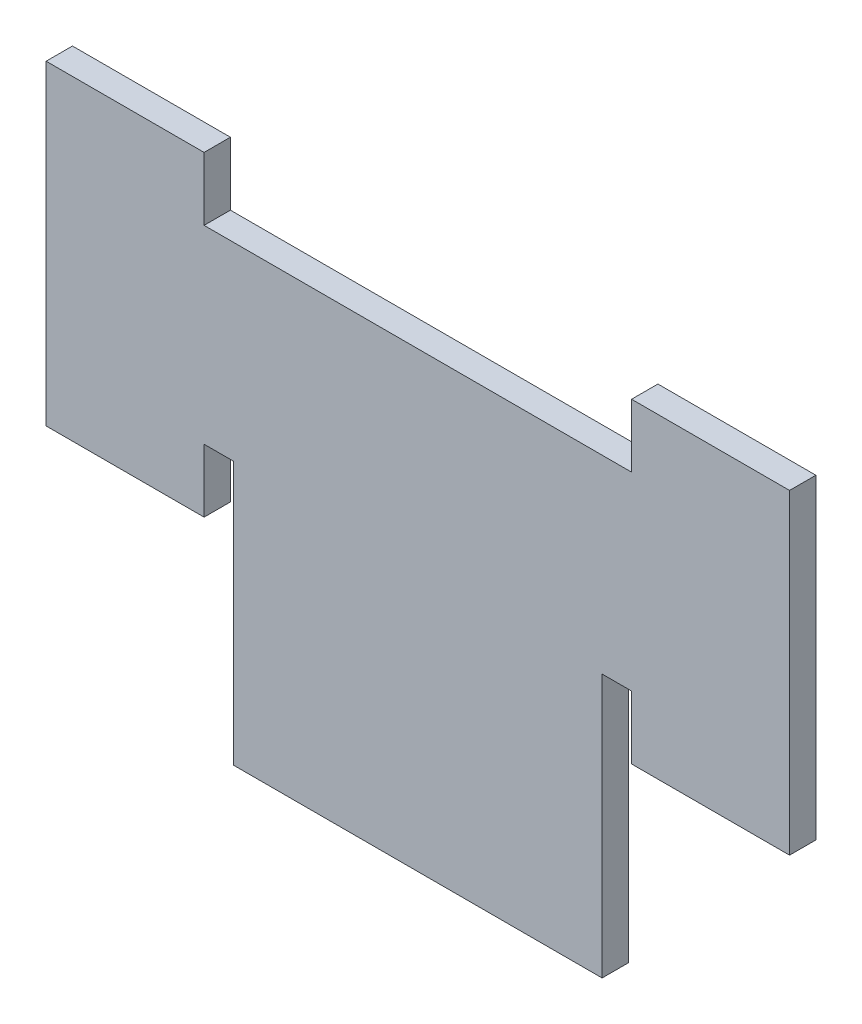
ISO-10303-21;
HEADER;
FILE_DESCRIPTION(('STEP AP214'),'2;1');
FILE_NAME('part.step','',(''),(''),'','','');
FILE_SCHEMA(('AUTOMOTIVE_DESIGN { 1 0 10303 214 1 1 1 1 }'));
ENDSEC;
DATA;
#1=APPLICATION_CONTEXT('core data for automotive mechanical design processes');
#2=APPLICATION_PROTOCOL_DEFINITION('international standard','automotive_design',2000,#1);
#3=PRODUCT_CONTEXT('',#1,'mechanical');
#4=PRODUCT('Part','Part','',(#3));
#5=PRODUCT_RELATED_PRODUCT_CATEGORY('part','',(#4));
#6=PRODUCT_DEFINITION_FORMATION('','',#4);
#7=PRODUCT_DEFINITION_CONTEXT('part definition',#1,'design');
#8=PRODUCT_DEFINITION('design','',#6,#7);
#9=PRODUCT_DEFINITION_SHAPE('','',#8);
#10=(LENGTH_UNIT() NAMED_UNIT(*) SI_UNIT(.MILLI.,.METRE.));
#11=(NAMED_UNIT(*) PLANE_ANGLE_UNIT() SI_UNIT($,.RADIAN.));
#12=(NAMED_UNIT(*) SI_UNIT($,.STERADIAN.) SOLID_ANGLE_UNIT());
#13=UNCERTAINTY_MEASURE_WITH_UNIT(LENGTH_MEASURE(1.E-05),#10,'distance_accuracy_value','');
#14=(GEOMETRIC_REPRESENTATION_CONTEXT(3) GLOBAL_UNCERTAINTY_ASSIGNED_CONTEXT((#13)) GLOBAL_UNIT_ASSIGNED_CONTEXT((#10,
#11,#12)) REPRESENTATION_CONTEXT('',''));
#15=CARTESIAN_POINT('',(0.,0.,0.));
#16=DIRECTION('',(0.,0.,1.));
#17=DIRECTION('',(1.,0.,0.));
#18=AXIS2_PLACEMENT_3D('',#15,#16,#17);
#19=CARTESIAN_POINT('',(44.45,31.75,3.175));
#20=DIRECTION('',(-1.,0.,0.));
#21=DIRECTION('',(0.,-1.,0.));
#22=AXIS2_PLACEMENT_3D('',#19,#20,#21);
#23=PLANE('',#22);
#24=DIRECTION('',(0.,1.,0.));
#25=VECTOR('',#24,1.);
#26=CARTESIAN_POINT('',(44.45,31.75,0.));
#27=LINE('',#26,#25);
#28=CARTESIAN_POINT('',(44.45,0.,0.));
#29=VERTEX_POINT('',#28);
#30=CARTESIAN_POINT('',(44.45,31.75,0.));
#31=VERTEX_POINT('',#30);
#32=EDGE_CURVE('E176',#29,#31,#27,.T.);
#33=ORIENTED_EDGE('',*,*,#32,.T.);
#34=DIRECTION('',(0.,0.,-1.));
#35=VECTOR('',#34,1.);
#36=CARTESIAN_POINT('',(44.45,31.75,3.175));
#37=LINE('',#36,#35);
#38=CARTESIAN_POINT('',(44.45,31.75,3.175));
#39=VERTEX_POINT('',#38);
#40=EDGE_CURVE('E11',#39,#31,#37,.T.);
#41=ORIENTED_EDGE('',*,*,#40,.F.);
#42=DIRECTION('',(0.,1.,0.));
#43=VECTOR('',#42,1.);
#44=CARTESIAN_POINT('',(44.45,31.75,3.175));
#45=LINE('',#44,#43);
#46=CARTESIAN_POINT('',(44.45,0.,3.175));
#47=VERTEX_POINT('',#46);
#48=EDGE_CURVE('E206',#47,#39,#45,.T.);
#49=ORIENTED_EDGE('',*,*,#48,.F.);
#50=DIRECTION('',(0.,0.,-1.));
#51=VECTOR('',#50,1.);
#52=CARTESIAN_POINT('',(44.45,0.,3.175));
#53=LINE('',#52,#51);
#54=EDGE_CURVE('E172',#47,#29,#53,.T.);
#55=ORIENTED_EDGE('',*,*,#54,.T.);
#56=EDGE_LOOP('',(#33,#41,#49,#55));
#57=FACE_BOUND('',#56,.T.);
#58=ADVANCED_FACE('F32',(#57),#23,.F.);
#59=CARTESIAN_POINT('',(44.45,31.75,3.175));
#60=DIRECTION('',(0.,1.,0.));
#61=DIRECTION('',(-1.,0.,0.));
#62=AXIS2_PLACEMENT_3D('',#59,#60,#61);
#63=PLANE('',#62);
#64=DIRECTION('',(1.,0.,0.));
#65=VECTOR('',#64,1.);
#66=CARTESIAN_POINT('',(44.45,31.75,0.));
#67=LINE('',#66,#65);
#68=CARTESIAN_POINT('',(48.006,31.75,0.));
#69=VERTEX_POINT('',#68);
#70=EDGE_CURVE('E179',#31,#69,#67,.T.);
#71=ORIENTED_EDGE('',*,*,#70,.T.);
#72=DIRECTION('',(0.,0.,-1.));
#73=VECTOR('',#72,1.);
#74=CARTESIAN_POINT('',(48.006,31.75,3.175));
#75=LINE('',#74,#73);
#76=CARTESIAN_POINT('',(48.006,31.75,3.175));
#77=VERTEX_POINT('',#76);
#78=EDGE_CURVE('E40',#77,#69,#75,.T.);
#79=ORIENTED_EDGE('',*,*,#78,.F.);
#80=DIRECTION('',(1.,0.,0.));
#81=VECTOR('',#80,1.);
#82=CARTESIAN_POINT('',(44.45,31.75,3.175));
#83=LINE('',#82,#81);
#84=EDGE_CURVE('E115',#39,#77,#83,.T.);
#85=ORIENTED_EDGE('',*,*,#84,.F.);
#86=ORIENTED_EDGE('',*,*,#40,.T.);
#87=EDGE_LOOP('',(#71,#79,#85,#86));
#88=FACE_BOUND('',#87,.T.);
#89=ADVANCED_FACE('F304',(#88),#63,.F.);
#90=CARTESIAN_POINT('',(48.006,31.75,3.175));
#91=DIRECTION('',(1.,0.,0.));
#92=DIRECTION('',(0.,1.,0.));
#93=AXIS2_PLACEMENT_3D('',#90,#91,#92);
#94=PLANE('',#93);
#95=DIRECTION('',(0.,-1.,0.));
#96=VECTOR('',#95,1.);
#97=CARTESIAN_POINT('',(48.006,31.75,0.));
#98=LINE('',#97,#96);
#99=CARTESIAN_POINT('',(48.006,24.13,0.));
#100=VERTEX_POINT('',#99);
#101=EDGE_CURVE('E181',#69,#100,#98,.T.);
#102=ORIENTED_EDGE('',*,*,#101,.T.);
#103=DIRECTION('',(0.,0.,-1.));
#104=VECTOR('',#103,1.);
#105=CARTESIAN_POINT('',(48.006,24.13,3.175));
#106=LINE('',#105,#104);
#107=CARTESIAN_POINT('',(48.006,24.13,3.175));
#108=VERTEX_POINT('',#107);
#109=EDGE_CURVE('E237',#108,#100,#106,.T.);
#110=ORIENTED_EDGE('',*,*,#109,.F.);
#111=DIRECTION('',(0.,-1.,0.));
#112=VECTOR('',#111,1.);
#113=CARTESIAN_POINT('',(48.006,31.75,3.175));
#114=LINE('',#113,#112);
#115=EDGE_CURVE('E245',#77,#108,#114,.T.);
#116=ORIENTED_EDGE('',*,*,#115,.F.);
#117=ORIENTED_EDGE('',*,*,#78,.T.);
#118=EDGE_LOOP('',(#102,#110,#116,#117));
#119=FACE_BOUND('',#118,.T.);
#120=ADVANCED_FACE('F243',(#119),#94,.F.);
#121=CARTESIAN_POINT('',(48.006,24.13,3.175));
#122=DIRECTION('',(0.,1.,0.));
#123=DIRECTION('',(-1.,0.,0.));
#124=AXIS2_PLACEMENT_3D('',#121,#122,#123);
#125=PLANE('',#124);
#126=DIRECTION('',(1.,0.,0.));
#127=VECTOR('',#126,1.);
#128=CARTESIAN_POINT('',(48.006,24.13,0.));
#129=LINE('',#128,#127);
#130=CARTESIAN_POINT('',(67.056,24.13,0.));
#131=VERTEX_POINT('',#130);
#132=EDGE_CURVE('E183',#100,#131,#129,.T.);
#133=ORIENTED_EDGE('',*,*,#132,.T.);
#134=DIRECTION('',(0.,0.,-1.));
#135=VECTOR('',#134,1.);
#136=CARTESIAN_POINT('',(67.056,24.13,3.175));
#137=LINE('',#136,#135);
#138=CARTESIAN_POINT('',(67.056,24.13,3.175));
#139=VERTEX_POINT('',#138);
#140=EDGE_CURVE('E234',#139,#131,#137,.T.);
#141=ORIENTED_EDGE('',*,*,#140,.F.);
#142=DIRECTION('',(1.,0.,0.));
#143=VECTOR('',#142,1.);
#144=CARTESIAN_POINT('',(48.006,24.13,3.175));
#145=LINE('',#144,#143);
#146=EDGE_CURVE('E263',#108,#139,#145,.T.);
#147=ORIENTED_EDGE('',*,*,#146,.F.);
#148=ORIENTED_EDGE('',*,*,#109,.T.);
#149=EDGE_LOOP('',(#133,#141,#147,#148));
#150=FACE_BOUND('',#149,.T.);
#151=ADVANCED_FACE('F254',(#150),#125,.F.);
#152=CARTESIAN_POINT('',(67.056,24.13,3.175));
#153=DIRECTION('',(-1.,0.,0.));
#154=DIRECTION('',(0.,0.,1.));
#155=AXIS2_PLACEMENT_3D('',#152,#153,#154);
#156=PLANE('',#155);
#157=DIRECTION('',(0.,1.,0.));
#158=VECTOR('',#157,1.);
#159=CARTESIAN_POINT('',(67.056,24.13,0.));
#160=LINE('',#159,#158);
#161=CARTESIAN_POINT('',(67.056,62.23,0.));
#162=VERTEX_POINT('',#161);
#163=EDGE_CURVE('E185',#131,#162,#160,.T.);
#164=ORIENTED_EDGE('',*,*,#163,.T.);
#165=DIRECTION('',(0.,0.,-1.));
#166=VECTOR('',#165,1.);
#167=CARTESIAN_POINT('',(67.056,62.23,3.175));
#168=LINE('',#167,#166);
#169=CARTESIAN_POINT('',(67.056,62.23,3.175));
#170=VERTEX_POINT('',#169);
#171=EDGE_CURVE('E231',#170,#162,#168,.T.);
#172=ORIENTED_EDGE('',*,*,#171,.F.);
#173=DIRECTION('',(0.,1.,0.));
#174=VECTOR('',#173,1.);
#175=CARTESIAN_POINT('',(67.056,24.13,3.175));
#176=LINE('',#175,#174);
#177=EDGE_CURVE('E260',#139,#170,#176,.T.);
#178=ORIENTED_EDGE('',*,*,#177,.F.);
#179=ORIENTED_EDGE('',*,*,#140,.T.);
#180=EDGE_LOOP('',(#164,#172,#178,#179));
#181=FACE_BOUND('',#180,.T.);
#182=ADVANCED_FACE('F258',(#181),#156,.F.);
#183=CARTESIAN_POINT('',(67.056,62.23,3.175));
#184=DIRECTION('',(0.,-1.,0.));
#185=DIRECTION('',(0.,0.,-1.));
#186=AXIS2_PLACEMENT_3D('',#183,#184,#185);
#187=PLANE('',#186);
#188=DIRECTION('',(-1.,0.,0.));
#189=VECTOR('',#188,1.);
#190=CARTESIAN_POINT('',(67.056,62.23,0.));
#191=LINE('',#190,#189);
#192=CARTESIAN_POINT('',(48.006,62.23,0.));
#193=VERTEX_POINT('',#192);
#194=EDGE_CURVE('E187',#162,#193,#191,.T.);
#195=ORIENTED_EDGE('',*,*,#194,.T.);
#196=DIRECTION('',(0.,0.,-1.));
#197=VECTOR('',#196,1.);
#198=CARTESIAN_POINT('',(48.006,62.23,3.175));
#199=LINE('',#198,#197);
#200=CARTESIAN_POINT('',(48.006,62.23,3.175));
#201=VERTEX_POINT('',#200);
#202=EDGE_CURVE('E228',#201,#193,#199,.T.);
#203=ORIENTED_EDGE('',*,*,#202,.F.);
#204=DIRECTION('',(-1.,0.,0.));
#205=VECTOR('',#204,1.);
#206=CARTESIAN_POINT('',(67.056,62.23,3.175));
#207=LINE('',#206,#205);
#208=EDGE_CURVE('E262',#170,#201,#207,.T.);
#209=ORIENTED_EDGE('',*,*,#208,.F.);
#210=ORIENTED_EDGE('',*,*,#171,.T.);
#211=EDGE_LOOP('',(#195,#203,#209,#210));
#212=FACE_BOUND('',#211,.T.);
#213=ADVANCED_FACE('F317',(#212),#187,.F.);
#214=CARTESIAN_POINT('',(48.006,62.23,3.175));
#215=DIRECTION('',(1.,0.,0.));
#216=DIRECTION('',(0.,1.,0.));
#217=AXIS2_PLACEMENT_3D('',#214,#215,#216);
#218=PLANE('',#217);
#219=DIRECTION('',(0.,-1.,0.));
#220=VECTOR('',#219,1.);
#221=CARTESIAN_POINT('',(48.006,62.23,0.));
#222=LINE('',#221,#220);
#223=CARTESIAN_POINT('',(48.006,54.61,0.));
#224=VERTEX_POINT('',#223);
#225=EDGE_CURVE('E189',#193,#224,#222,.T.);
#226=ORIENTED_EDGE('',*,*,#225,.T.);
#227=DIRECTION('',(0.,0.,-1.));
#228=VECTOR('',#227,1.);
#229=CARTESIAN_POINT('',(48.006,54.61,3.175));
#230=LINE('',#229,#228);
#231=CARTESIAN_POINT('',(48.006,54.61,3.175));
#232=VERTEX_POINT('',#231);
#233=EDGE_CURVE('E225',#232,#224,#230,.T.);
#234=ORIENTED_EDGE('',*,*,#233,.F.);
#235=DIRECTION('',(0.,-1.,0.));
#236=VECTOR('',#235,1.);
#237=CARTESIAN_POINT('',(48.006,62.23,3.175));
#238=LINE('',#237,#236);
#239=EDGE_CURVE('E265',#201,#232,#238,.T.);
#240=ORIENTED_EDGE('',*,*,#239,.F.);
#241=ORIENTED_EDGE('',*,*,#202,.T.);
#242=EDGE_LOOP('',(#226,#234,#240,#241));
#243=FACE_BOUND('',#242,.T.);
#244=ADVANCED_FACE('F320',(#243),#218,.F.);
#245=CARTESIAN_POINT('',(-3.556,54.61,3.175));
#246=DIRECTION('',(0.,-1.,0.));
#247=DIRECTION('',(0.,0.,-1.));
#248=AXIS2_PLACEMENT_3D('',#245,#246,#247);
#249=PLANE('',#248);
#250=DIRECTION('',(-1.,0.,0.));
#251=VECTOR('',#250,1.);
#252=CARTESIAN_POINT('',(-3.556,54.61,0.));
#253=LINE('',#252,#251);
#254=CARTESIAN_POINT('',(-3.556,54.61,0.));
#255=VERTEX_POINT('',#254);
#256=EDGE_CURVE('E191',#224,#255,#253,.T.);
#257=ORIENTED_EDGE('',*,*,#256,.T.);
#258=DIRECTION('',(0.,0.,-1.));
#259=VECTOR('',#258,1.);
#260=CARTESIAN_POINT('',(-3.556,54.61,3.175));
#261=LINE('',#260,#259);
#262=CARTESIAN_POINT('',(-3.556,54.61,3.175));
#263=VERTEX_POINT('',#262);
#264=EDGE_CURVE('E222',#263,#255,#261,.T.);
#265=ORIENTED_EDGE('',*,*,#264,.F.);
#266=DIRECTION('',(-1.,0.,0.));
#267=VECTOR('',#266,1.);
#268=CARTESIAN_POINT('',(-3.556,54.61,3.175));
#269=LINE('',#268,#267);
#270=EDGE_CURVE('E271',#232,#263,#269,.T.);
#271=ORIENTED_EDGE('',*,*,#270,.F.);
#272=ORIENTED_EDGE('',*,*,#233,.T.);
#273=EDGE_LOOP('',(#257,#265,#271,#272));
#274=FACE_BOUND('',#273,.T.);
#275=ADVANCED_FACE('F324',(#274),#249,.F.);
#276=CARTESIAN_POINT('',(-3.556,62.23,3.175));
#277=DIRECTION('',(-1.,0.,0.));
#278=DIRECTION('',(0.,-1.,0.));
#279=AXIS2_PLACEMENT_3D('',#276,#277,#278);
#280=PLANE('',#279);
#281=DIRECTION('',(0.,1.,0.));
#282=VECTOR('',#281,1.);
#283=CARTESIAN_POINT('',(-3.556,62.23,0.));
#284=LINE('',#283,#282);
#285=CARTESIAN_POINT('',(-3.556,62.23,0.));
#286=VERTEX_POINT('',#285);
#287=EDGE_CURVE('E193',#255,#286,#284,.T.);
#288=ORIENTED_EDGE('',*,*,#287,.T.);
#289=DIRECTION('',(0.,0.,-1.));
#290=VECTOR('',#289,1.);
#291=CARTESIAN_POINT('',(-3.556,62.23,3.175));
#292=LINE('',#291,#290);
#293=CARTESIAN_POINT('',(-3.556,62.23,3.175));
#294=VERTEX_POINT('',#293);
#295=EDGE_CURVE('E219',#294,#286,#292,.T.);
#296=ORIENTED_EDGE('',*,*,#295,.F.);
#297=DIRECTION('',(0.,1.,0.));
#298=VECTOR('',#297,1.);
#299=CARTESIAN_POINT('',(-3.556,62.23,3.175));
#300=LINE('',#299,#298);
#301=EDGE_CURVE('E273',#263,#294,#300,.T.);
#302=ORIENTED_EDGE('',*,*,#301,.F.);
#303=ORIENTED_EDGE('',*,*,#264,.T.);
#304=EDGE_LOOP('',(#288,#296,#302,#303));
#305=FACE_BOUND('',#304,.T.);
#306=ADVANCED_FACE('F328',(#305),#280,.F.);
#307=CARTESIAN_POINT('',(-22.606,62.23,3.175));
#308=DIRECTION('',(0.,-1.,0.));
#309=DIRECTION('',(1.,0.,0.));
#310=AXIS2_PLACEMENT_3D('',#307,#308,#309);
#311=PLANE('',#310);
#312=DIRECTION('',(-1.,0.,0.));
#313=VECTOR('',#312,1.);
#314=CARTESIAN_POINT('',(-22.606,62.23,0.));
#315=LINE('',#314,#313);
#316=CARTESIAN_POINT('',(-22.606,62.23,0.));
#317=VERTEX_POINT('',#316);
#318=EDGE_CURVE('E195',#286,#317,#315,.T.);
#319=ORIENTED_EDGE('',*,*,#318,.T.);
#320=DIRECTION('',(0.,0.,-1.));
#321=VECTOR('',#320,1.);
#322=CARTESIAN_POINT('',(-22.606,62.23,3.175));
#323=LINE('',#322,#321);
#324=CARTESIAN_POINT('',(-22.606,62.23,3.175));
#325=VERTEX_POINT('',#324);
#326=EDGE_CURVE('E216',#325,#317,#323,.T.);
#327=ORIENTED_EDGE('',*,*,#326,.F.);
#328=DIRECTION('',(-1.,0.,0.));
#329=VECTOR('',#328,1.);
#330=CARTESIAN_POINT('',(-22.606,62.23,3.175));
#331=LINE('',#330,#329);
#332=EDGE_CURVE('E275',#294,#325,#331,.T.);
#333=ORIENTED_EDGE('',*,*,#332,.F.);
#334=ORIENTED_EDGE('',*,*,#295,.T.);
#335=EDGE_LOOP('',(#319,#327,#333,#334));
#336=FACE_BOUND('',#335,.T.);
#337=ADVANCED_FACE('F332',(#336),#311,.F.);
#338=CARTESIAN_POINT('',(-22.606,24.13,3.175));
#339=DIRECTION('',(1.,0.,0.));
#340=DIRECTION('',(0.,0.,-1.));
#341=AXIS2_PLACEMENT_3D('',#338,#339,#340);
#342=PLANE('',#341);
#343=DIRECTION('',(0.,-1.,0.));
#344=VECTOR('',#343,1.);
#345=CARTESIAN_POINT('',(-22.606,24.13,0.));
#346=LINE('',#345,#344);
#347=CARTESIAN_POINT('',(-22.606,24.13,0.));
#348=VERTEX_POINT('',#347);
#349=EDGE_CURVE('E197',#317,#348,#346,.T.);
#350=ORIENTED_EDGE('',*,*,#349,.T.);
#351=DIRECTION('',(0.,0.,-1.));
#352=VECTOR('',#351,1.);
#353=CARTESIAN_POINT('',(-22.606,24.13,3.175));
#354=LINE('',#353,#352);
#355=CARTESIAN_POINT('',(-22.606,24.13,3.175));
#356=VERTEX_POINT('',#355);
#357=EDGE_CURVE('E213',#356,#348,#354,.T.);
#358=ORIENTED_EDGE('',*,*,#357,.F.);
#359=DIRECTION('',(0.,-1.,0.));
#360=VECTOR('',#359,1.);
#361=CARTESIAN_POINT('',(-22.606,24.13,3.175));
#362=LINE('',#361,#360);
#363=EDGE_CURVE('E277',#325,#356,#362,.T.);
#364=ORIENTED_EDGE('',*,*,#363,.F.);
#365=ORIENTED_EDGE('',*,*,#326,.T.);
#366=EDGE_LOOP('',(#350,#358,#364,#365));
#367=FACE_BOUND('',#366,.T.);
#368=ADVANCED_FACE('F336',(#367),#342,.F.);
#369=CARTESIAN_POINT('',(-3.556,24.13,3.175));
#370=DIRECTION('',(0.,1.,0.));
#371=DIRECTION('',(0.,0.,1.));
#372=AXIS2_PLACEMENT_3D('',#369,#370,#371);
#373=PLANE('',#372);
#374=DIRECTION('',(1.,0.,0.));
#375=VECTOR('',#374,1.);
#376=CARTESIAN_POINT('',(-3.556,24.13,0.));
#377=LINE('',#376,#375);
#378=CARTESIAN_POINT('',(-3.556,24.13,0.));
#379=VERTEX_POINT('',#378);
#380=EDGE_CURVE('E199',#348,#379,#377,.T.);
#381=ORIENTED_EDGE('',*,*,#380,.T.);
#382=DIRECTION('',(0.,0.,-1.));
#383=VECTOR('',#382,1.);
#384=CARTESIAN_POINT('',(-3.556,24.13,3.175));
#385=LINE('',#384,#383);
#386=CARTESIAN_POINT('',(-3.556,24.13,3.175));
#387=VERTEX_POINT('',#386);
#388=EDGE_CURVE('E210',#387,#379,#385,.T.);
#389=ORIENTED_EDGE('',*,*,#388,.F.);
#390=DIRECTION('',(1.,0.,0.));
#391=VECTOR('',#390,1.);
#392=CARTESIAN_POINT('',(-3.556,24.13,3.175));
#393=LINE('',#392,#391);
#394=EDGE_CURVE('E279',#356,#387,#393,.T.);
#395=ORIENTED_EDGE('',*,*,#394,.F.);
#396=ORIENTED_EDGE('',*,*,#357,.T.);
#397=EDGE_LOOP('',(#381,#389,#395,#396));
#398=FACE_BOUND('',#397,.T.);
#399=ADVANCED_FACE('F285',(#398),#373,.F.);
#400=CARTESIAN_POINT('',(-3.556,31.75,3.175));
#401=DIRECTION('',(-1.,0.,0.));
#402=DIRECTION('',(0.,-1.,0.));
#403=AXIS2_PLACEMENT_3D('',#400,#401,#402);
#404=PLANE('',#403);
#405=DIRECTION('',(0.,1.,0.));
#406=VECTOR('',#405,1.);
#407=CARTESIAN_POINT('',(-3.556,31.75,0.));
#408=LINE('',#407,#406);
#409=CARTESIAN_POINT('',(-3.556,31.75,0.));
#410=VERTEX_POINT('',#409);
#411=EDGE_CURVE('E201',#379,#410,#408,.T.);
#412=ORIENTED_EDGE('',*,*,#411,.T.);
#413=DIRECTION('',(0.,0.,-1.));
#414=VECTOR('',#413,1.);
#415=CARTESIAN_POINT('',(-3.556,31.75,3.175));
#416=LINE('',#415,#414);
#417=CARTESIAN_POINT('',(-3.556,31.75,3.175));
#418=VERTEX_POINT('',#417);
#419=EDGE_CURVE('E167',#418,#410,#416,.T.);
#420=ORIENTED_EDGE('',*,*,#419,.F.);
#421=DIRECTION('',(0.,1.,0.));
#422=VECTOR('',#421,1.);
#423=CARTESIAN_POINT('',(-3.556,31.75,3.175));
#424=LINE('',#423,#422);
#425=EDGE_CURVE('E158',#387,#418,#424,.T.);
#426=ORIENTED_EDGE('',*,*,#425,.F.);
#427=ORIENTED_EDGE('',*,*,#388,.T.);
#428=EDGE_LOOP('',(#412,#420,#426,#427));
#429=FACE_BOUND('',#428,.T.);
#430=ADVANCED_FACE('F289',(#429),#404,.F.);
#431=CARTESIAN_POINT('',(0.,31.75,3.175));
#432=DIRECTION('',(0.,1.,0.));
#433=DIRECTION('',(0.,0.,1.));
#434=AXIS2_PLACEMENT_3D('',#431,#432,#433);
#435=PLANE('',#434);
#436=DIRECTION('',(1.,0.,0.));
#437=VECTOR('',#436,1.);
#438=CARTESIAN_POINT('',(0.,31.75,0.));
#439=LINE('',#438,#437);
#440=CARTESIAN_POINT('',(0.,31.75,0.));
#441=VERTEX_POINT('',#440);
#442=EDGE_CURVE('E166',#410,#441,#439,.T.);
#443=ORIENTED_EDGE('',*,*,#442,.T.);
#444=DIRECTION('',(0.,0.,-1.));
#445=VECTOR('',#444,1.);
#446=CARTESIAN_POINT('',(0.,31.75,3.175));
#447=LINE('',#446,#445);
#448=CARTESIAN_POINT('',(0.,31.75,3.175));
#449=VERTEX_POINT('',#448);
#450=EDGE_CURVE('E163',#449,#441,#447,.T.);
#451=ORIENTED_EDGE('',*,*,#450,.F.);
#452=DIRECTION('',(1.,0.,0.));
#453=VECTOR('',#452,1.);
#454=CARTESIAN_POINT('',(0.,31.75,3.175));
#455=LINE('',#454,#453);
#456=EDGE_CURVE('E152',#418,#449,#455,.T.);
#457=ORIENTED_EDGE('',*,*,#456,.F.);
#458=ORIENTED_EDGE('',*,*,#419,.T.);
#459=EDGE_LOOP('',(#443,#451,#457,#458));
#460=FACE_BOUND('',#459,.T.);
#461=ADVANCED_FACE('F164',(#460),#435,.F.);
#462=CARTESIAN_POINT('',(0.,31.75,3.175));
#463=DIRECTION('',(1.,0.,0.));
#464=DIRECTION('',(0.,1.,0.));
#465=AXIS2_PLACEMENT_3D('',#462,#463,#464);
#466=PLANE('',#465);
#467=DIRECTION('',(0.,-1.,0.));
#468=VECTOR('',#467,1.);
#469=CARTESIAN_POINT('',(0.,31.75,0.));
#470=LINE('',#469,#468);
#471=CARTESIAN_POINT('',(0.,0.,0.));
#472=VERTEX_POINT('',#471);
#473=EDGE_CURVE('E101',#441,#472,#470,.T.);
#474=ORIENTED_EDGE('',*,*,#473,.T.);
#475=DIRECTION('',(0.,0.,-1.));
#476=VECTOR('',#475,1.);
#477=CARTESIAN_POINT('',(0.,0.,3.175));
#478=LINE('',#477,#476);
#479=CARTESIAN_POINT('',(0.,0.,3.175));
#480=VERTEX_POINT('',#479);
#481=EDGE_CURVE('E168',#480,#472,#478,.T.);
#482=ORIENTED_EDGE('',*,*,#481,.F.);
#483=DIRECTION('',(0.,-1.,0.));
#484=VECTOR('',#483,1.);
#485=CARTESIAN_POINT('',(0.,31.75,3.175));
#486=LINE('',#485,#484);
#487=EDGE_CURVE('E156',#449,#480,#486,.T.);
#488=ORIENTED_EDGE('',*,*,#487,.F.);
#489=ORIENTED_EDGE('',*,*,#450,.T.);
#490=EDGE_LOOP('',(#474,#482,#488,#489));
#491=FACE_BOUND('',#490,.T.);
#492=ADVANCED_FACE('F170',(#491),#466,.F.);
#493=CARTESIAN_POINT('',(0.,0.,3.175));
#494=DIRECTION('',(0.,1.,0.));
#495=DIRECTION('',(0.,0.,1.));
#496=AXIS2_PLACEMENT_3D('',#493,#494,#495);
#497=PLANE('',#496);
#498=DIRECTION('',(1.,0.,0.));
#499=VECTOR('',#498,1.);
#500=CARTESIAN_POINT('',(0.,0.,0.));
#501=LINE('',#500,#499);
#502=EDGE_CURVE('E107',#472,#29,#501,.T.);
#503=ORIENTED_EDGE('',*,*,#502,.T.);
#504=ORIENTED_EDGE('',*,*,#54,.F.);
#505=DIRECTION('',(1.,0.,0.));
#506=VECTOR('',#505,1.);
#507=CARTESIAN_POINT('',(0.,0.,3.175));
#508=LINE('',#507,#506);
#509=EDGE_CURVE('E48',#480,#47,#508,.T.);
#510=ORIENTED_EDGE('',*,*,#509,.F.);
#511=ORIENTED_EDGE('',*,*,#481,.T.);
#512=EDGE_LOOP('',(#503,#504,#510,#511));
#513=FACE_BOUND('',#512,.T.);
#514=ADVANCED_FACE('F293',(#513),#497,.F.);
#515=CARTESIAN_POINT('',(0.,0.,3.175));
#516=DIRECTION('',(0.,0.,1.));
#517=DIRECTION('',(1.,0.,0.));
#518=AXIS2_PLACEMENT_3D('',#515,#516,#517);
#519=PLANE('',#518);
#520=ORIENTED_EDGE('',*,*,#48,.T.);
#521=ORIENTED_EDGE('',*,*,#84,.T.);
#522=ORIENTED_EDGE('',*,*,#115,.T.);
#523=ORIENTED_EDGE('',*,*,#146,.T.);
#524=ORIENTED_EDGE('',*,*,#177,.T.);
#525=ORIENTED_EDGE('',*,*,#208,.T.);
#526=ORIENTED_EDGE('',*,*,#239,.T.);
#527=ORIENTED_EDGE('',*,*,#270,.T.);
#528=ORIENTED_EDGE('',*,*,#301,.T.);
#529=ORIENTED_EDGE('',*,*,#332,.T.);
#530=ORIENTED_EDGE('',*,*,#363,.T.);
#531=ORIENTED_EDGE('',*,*,#394,.T.);
#532=ORIENTED_EDGE('',*,*,#425,.T.);
#533=ORIENTED_EDGE('',*,*,#456,.T.);
#534=ORIENTED_EDGE('',*,*,#487,.T.);
#535=ORIENTED_EDGE('',*,*,#509,.T.);
#536=EDGE_LOOP('',(#520,#521,#522,#523,#524,#525,#526,#527,#528,#529,#530,#531,#532,#533,#534,#535));
#537=FACE_BOUND('',#536,.T.);
#538=ADVANCED_FACE('F154',(#537),#519,.T.);
#539=CARTESIAN_POINT('',(0.,0.,0.));
#540=DIRECTION('',(0.,0.,1.));
#541=DIRECTION('',(1.,0.,0.));
#542=AXIS2_PLACEMENT_3D('',#539,#540,#541);
#543=PLANE('',#542);
#544=ORIENTED_EDGE('',*,*,#32,.F.);
#545=ORIENTED_EDGE('',*,*,#502,.F.);
#546=ORIENTED_EDGE('',*,*,#473,.F.);
#547=ORIENTED_EDGE('',*,*,#442,.F.);
#548=ORIENTED_EDGE('',*,*,#411,.F.);
#549=ORIENTED_EDGE('',*,*,#380,.F.);
#550=ORIENTED_EDGE('',*,*,#349,.F.);
#551=ORIENTED_EDGE('',*,*,#318,.F.);
#552=ORIENTED_EDGE('',*,*,#287,.F.);
#553=ORIENTED_EDGE('',*,*,#256,.F.);
#554=ORIENTED_EDGE('',*,*,#225,.F.);
#555=ORIENTED_EDGE('',*,*,#194,.F.);
#556=ORIENTED_EDGE('',*,*,#163,.F.);
#557=ORIENTED_EDGE('',*,*,#132,.F.);
#558=ORIENTED_EDGE('',*,*,#101,.F.);
#559=ORIENTED_EDGE('',*,*,#70,.F.);
#560=EDGE_LOOP('',(#544,#545,#546,#547,#548,#549,#550,#551,#552,#553,#554,#555,#556,#557,#558,#559));
#561=FACE_BOUND('',#560,.T.);
#562=ADVANCED_FACE('F249',(#561),#543,.F.);
#563=CLOSED_SHELL('',(#58,#89,#120,#151,#182,#213,#244,#275,#306,#337,#368,#399,#430,#461,#492,
#514,#538,#562));
#564=MANIFOLD_SOLID_BREP('B2',#563);
#565=ADVANCED_BREP_SHAPE_REPRESENTATION('',(#18,#564),#14);
#566=SHAPE_DEFINITION_REPRESENTATION(#9,#565);
ENDSEC;
END-ISO-10303-21;
